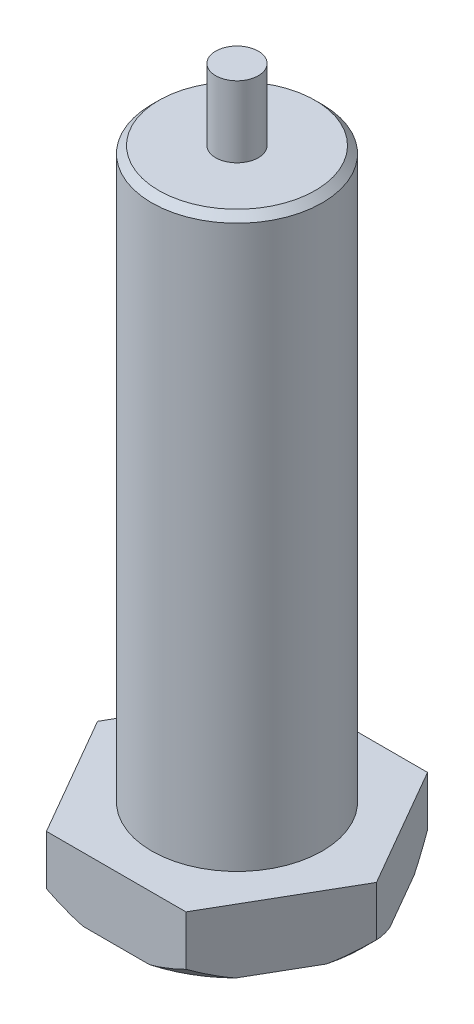
ISO-10303-21;
HEADER;
FILE_DESCRIPTION(('STEP AP214'),'2;1');
FILE_NAME('part.step','',(''),(''),'','','');
FILE_SCHEMA(('AUTOMOTIVE_DESIGN { 1 0 10303 214 1 1 1 1 }'));
ENDSEC;
DATA;
#1=APPLICATION_CONTEXT('core data for automotive mechanical design processes');
#2=APPLICATION_PROTOCOL_DEFINITION('international standard','automotive_design',2000,#1);
#3=PRODUCT_CONTEXT('',#1,'mechanical');
#4=PRODUCT('Part','Part','',(#3));
#5=PRODUCT_RELATED_PRODUCT_CATEGORY('part','',(#4));
#6=PRODUCT_DEFINITION_FORMATION('','',#4);
#7=PRODUCT_DEFINITION_CONTEXT('part definition',#1,'design');
#8=PRODUCT_DEFINITION('design','',#6,#7);
#9=PRODUCT_DEFINITION_SHAPE('','',#8);
#10=(LENGTH_UNIT() NAMED_UNIT(*) SI_UNIT(.MILLI.,.METRE.));
#11=(NAMED_UNIT(*) PLANE_ANGLE_UNIT() SI_UNIT($,.RADIAN.));
#12=(NAMED_UNIT(*) SI_UNIT($,.STERADIAN.) SOLID_ANGLE_UNIT());
#13=UNCERTAINTY_MEASURE_WITH_UNIT(LENGTH_MEASURE(1.E-05),#10,'distance_accuracy_value','');
#14=(GEOMETRIC_REPRESENTATION_CONTEXT(3) GLOBAL_UNCERTAINTY_ASSIGNED_CONTEXT((#13)) GLOBAL_UNIT_ASSIGNED_CONTEXT((#10,
#11,#12)) REPRESENTATION_CONTEXT('',''));
#15=CARTESIAN_POINT('',(0.,0.,0.));
#16=DIRECTION('',(0.,0.,1.));
#17=DIRECTION('',(1.,0.,0.));
#18=AXIS2_PLACEMENT_3D('',#15,#16,#17);
#19=CARTESIAN_POINT('',(4.90747728811192,4.5,8.49999999999995));
#20=DIRECTION('',(-0.866025403784442,0.,-0.499999999999995));
#21=DIRECTION('',(-0.499999999999995,0.,0.866025403784442));
#22=AXIS2_PLACEMENT_3D('',#19,#20,#21);
#23=PLANE('',#22);
#24=CARTESIAN_POINT('',(13.2326662424363,5.68129793130995,-5.91965025150134));
#25=CARTESIAN_POINT('',(13.1162303371106,5.49268103974737,-5.71797734765192));
#26=CARTESIAN_POINT('',(12.9993306817783,5.30519881466516,-5.51550120522915));
#27=CARTESIAN_POINT('',(12.7644427884288,4.93293940118731,-5.10866343986483));
#28=CARTESIAN_POINT('',(12.6464544518135,4.74816246179854,-4.90430164614669));
#29=CARTESIAN_POINT('',(12.4089636690778,4.38134272836976,-4.49295554411918));
#30=CARTESIAN_POINT('',(12.2894582603696,4.19930759249871,-4.28596610445728));
#31=CARTESIAN_POINT('',(12.0490307529332,3.83902658190025,-3.86953344604015));
#32=CARTESIAN_POINT('',(11.9281086930962,3.66078060352546,-3.66009029464667));
#33=CARTESIAN_POINT('',(11.6812332381678,3.30389914584097,-3.23248946356893));
#34=CARTESIAN_POINT('',(11.5552335686476,3.12539139678304,-3.01425163422318));
#35=CARTESIAN_POINT('',(11.3012333820461,2.7741680843672,-2.57431040589736));
#36=CARTESIAN_POINT('',(11.1732329427186,2.60145229673873,-2.35260714159088));
#37=CARTESIAN_POINT('',(10.9150163419313,2.26324850984996,-1.90536286966965));
#38=CARTESIAN_POINT('',(10.7848021945026,2.09775438306884,-1.67982535045888));
#39=CARTESIAN_POINT('',(10.5217029065947,1.77552442691289,-1.22412401636721));
#40=CARTESIAN_POINT('',(10.3888181140318,1.61878746663282,-0.993960804094993));
#41=CARTESIAN_POINT('',(10.1172126193815,1.3131034423094,-0.523526287745761));
#42=CARTESIAN_POINT('',(9.97842813665329,1.164381552261,-0.283144512358328));
#43=CARTESIAN_POINT('',(9.6972100947022,0.881204924464254,0.203939424306002));
#44=CARTESIAN_POINT('',(9.5547760211525,0.746752211513423,0.450642476423087));
#45=CARTESIAN_POINT('',(9.26674062872542,0.496562572730395,0.949534410484841));
#46=CARTESIAN_POINT('',(9.12116086967094,0.380727392183433,1.20168594972084));
#47=CARTESIAN_POINT('',(8.82602346792519,0.171363651450167,1.71287892475835));
#48=CARTESIAN_POINT('',(8.67646703075684,0.0778284148685671,1.97191827253291));
#49=CARTESIAN_POINT('',(8.40302452442077,-0.0666188933519791,2.44553458645597));
#50=CARTESIAN_POINT('',(8.27976864888044,-0.12227591431339,2.6590200252232));
#51=CARTESIAN_POINT('',(8.03140302503451,-0.213532215119374,3.0892019045779));
#52=CARTESIAN_POINT('',(7.90629354892231,-0.249134410548993,3.30589787371257));
#53=CARTESIAN_POINT('',(7.65520245690741,-0.298450671328251,3.74080040241032));
#54=CARTESIAN_POINT('',(7.52922271033152,-0.31220226427138,3.95900372420442));
#55=CARTESIAN_POINT('',(7.27714825574375,-0.317180016737691,4.39560948684066));
#56=CARTESIAN_POINT('',(7.15105354631751,-0.308405895289244,4.61401193013255));
#57=CARTESIAN_POINT('',(6.90008711744869,-0.268872183088487,5.04869853592748));
#58=CARTESIAN_POINT('',(6.77521300780712,-0.238172317022629,5.2649868383766));
#59=CARTESIAN_POINT('',(6.52715484718689,-0.156426680105267,5.69463617580292));
#60=CARTESIAN_POINT('',(6.40397093633212,-0.105379232779083,5.90799696807843));
#61=CARTESIAN_POINT('',(6.15948648206728,0.0149708460164919,6.33145646452588));
#62=CARTESIAN_POINT('',(6.03819273208176,0.084328020725592,6.54154340214136));
#63=CARTESIAN_POINT('',(5.79815487998059,0.23867581498522,6.9573011577203));
#64=CARTESIAN_POINT('',(5.67941065251413,0.323665663959003,7.16297219279773));
#65=CARTESIAN_POINT('',(5.40171059472822,0.540184838624473,7.64396280214773));
#66=CARTESIAN_POINT('',(5.24386509772279,0.67738899804739,7.9173592227071));
#67=CARTESIAN_POINT('',(4.93264719628276,0.970925156585495,8.45640444022621));
#68=CARTESIAN_POINT('',(4.77927736117969,1.12726788505353,8.7220487869732));
#69=CARTESIAN_POINT('',(4.47625541490703,1.45508985984029,9.24689819372585));
#70=CARTESIAN_POINT('',(4.32661169701155,1.6265999033019,9.50608871615434));
#71=CARTESIAN_POINT('',(4.03084527988625,1.98116484321992,10.018371177788));
#72=CARTESIAN_POINT('',(3.88472193694064,2.16421760655322,10.2714642319416));
#73=CARTESIAN_POINT('',(3.59478678362472,2.54029176379239,10.773646648385));
#74=CARTESIAN_POINT('',(3.45098851829792,2.73335473090789,11.0227125499713));
#75=CARTESIAN_POINT('',(3.16592329593742,3.12681129664801,11.5164599985706));
#76=CARTESIAN_POINT('',(3.02465643208483,3.32720516430125,11.7611413841892));
#77=CARTESIAN_POINT('',(2.74441680641976,3.73368575296569,12.2465306541352));
#78=CARTESIAN_POINT('',(2.6054418015308,3.93976630608928,12.487242423585));
#79=CARTESIAN_POINT('',(2.32931512220333,4.35673312702703,12.9655078615055));
#80=CARTESIAN_POINT('',(2.19216340139376,4.56761927225031,13.2030616102932));
#81=CARTESIAN_POINT('',(1.96055376245671,4.92914544471732,13.6042212724548));
#82=CARTESIAN_POINT('',(1.86569780881451,5.07876836868562,13.7685166035635));
#83=CARTESIAN_POINT('',(1.67705132914126,5.37911798470893,14.0952618910266));
#84=CARTESIAN_POINT('',(1.58325804211787,5.52983773758225,14.25771662956));
#85=CARTESIAN_POINT('',(1.48976562189923,5.68129793130995,14.4196502515013));
#86=B_SPLINE_CURVE_WITH_KNOTS('',3,(#24,#25,#26,#27,#28,#29,#30,#31,#32,#33,#34,#35,#36,#37,#38,
#39,#40,#41,#42,#43,#44,#45,#46,#47,#48,#49,#50,#51,#52,#53,#54,#55,#56,#57,#58,#59,#60,#61,#62,
#63,#64,#65,#66,#67,#68,#69,#70,#71,#72,#73,#74,#75,#76,#77,#78,#79,#80,#81,#82,#83,#84,#85),
.UNSPECIFIED.,.F.,.F.,(4,2,2,2,2,2,2,2,2,2,2,2,2,2,2,2,2,2,2,2,2,2,2,2,2,2,2,2,2,2,4),(0.,
0.899033734706083,1.79814970682813,2.69943147575017,3.60068855949874,4.52707645960335,
5.45342844752593,6.37897851072498,7.30440877029756,8.24878511184261,9.1932952818026,
10.132644331677,11.0717117950455,11.829137360152,12.586452781744,13.3424661310549,
14.0984889104479,14.8524601358718,15.6064934952177,16.3627989161892,17.1190670668093,
18.150849268061,19.1832125730673,20.2177224516603,21.2520417074142,22.2910678122068,
23.3301320853982,24.3681105328969,25.4060625310908,26.1308970907607,26.852791461475),.UNSPECIFIED.);
#87=CARTESIAN_POINT('',(9.81495457622364,0.99984898859778,0.));
#88=VERTEX_POINT('',#87);
#89=CARTESIAN_POINT('',(8.52912929806785,0.,2.22711471142224));
#90=VERTEX_POINT('',#89);
#91=EDGE_CURVE('E288',#88,#90,#86,.T.);
#92=ORIENTED_EDGE('',*,*,#91,.F.);
#93=DIRECTION('',(0.,-1.,0.));
#94=VECTOR('',#93,1.);
#95=CARTESIAN_POINT('',(9.81495457622364,4.5,0.));
#96=LINE('',#95,#94);
#97=CARTESIAN_POINT('',(9.81495457622364,4.5,0.));
#98=VERTEX_POINT('',#97);
#99=EDGE_CURVE('E146',#98,#88,#96,.T.);
#100=ORIENTED_EDGE('',*,*,#99,.F.);
#101=DIRECTION('',(0.499999999999995,0.,-0.866025403784442));
#102=VECTOR('',#101,1.);
#103=CARTESIAN_POINT('',(4.90747728811192,4.5,8.49999999999995));
#104=LINE('',#103,#102);
#105=CARTESIAN_POINT('',(4.90747728811192,4.5,8.49999999999995));
#106=VERTEX_POINT('',#105);
#107=EDGE_CURVE('E201',#106,#98,#104,.T.);
#108=ORIENTED_EDGE('',*,*,#107,.F.);
#109=DIRECTION('',(0.,-1.,0.));
#110=VECTOR('',#109,1.);
#111=CARTESIAN_POINT('',(4.90747728811192,4.5,8.49999999999995));
#112=LINE('',#111,#110);
#113=CARTESIAN_POINT('',(4.90747728811192,0.99984898859778,8.49999999999995));
#114=VERTEX_POINT('',#113);
#115=EDGE_CURVE('E207',#106,#114,#112,.T.);
#116=ORIENTED_EDGE('',*,*,#115,.T.);
#117=CARTESIAN_POINT('',(6.19330256626771,0.,6.2728852885777));
#118=VERTEX_POINT('',#117);
#119=EDGE_CURVE('E191',#118,#114,#86,.T.);
#120=ORIENTED_EDGE('',*,*,#119,.F.);
#121=DIRECTION('',(0.499999999999995,0.,-0.866025403784442));
#122=VECTOR('',#121,1.);
#123=CARTESIAN_POINT('',(4.90747728811192,0.,8.49999999999995));
#124=LINE('',#123,#122);
#125=EDGE_CURVE('E291',#118,#90,#124,.T.);
#126=ORIENTED_EDGE('',*,*,#125,.T.);
#127=EDGE_LOOP('',(#92,#100,#108,#116,#120,#126));
#128=FACE_BOUND('',#127,.T.);
#129=ADVANCED_FACE('F36',(#128),#23,.F.);
#130=CARTESIAN_POINT('',(9.81495457622364,4.5,0.));
#131=DIRECTION('',(-0.866025403784438,0.,0.500000000000001));
#132=DIRECTION('',(0.500000000000001,0.,0.866025403784438));
#133=AXIS2_PLACEMENT_3D('',#130,#131,#132);
#134=PLANE('',#133);
#135=CARTESIAN_POINT('',(1.48976562189902,5.68129793131007,-14.4196502515014));
#136=CARTESIAN_POINT('',(1.60620152722473,5.4926810397475,-14.217977347652));
#137=CARTESIAN_POINT('',(1.723101182557,5.30519881466528,-14.0155012052292));
#138=CARTESIAN_POINT('',(1.95798907590659,4.93293940118744,-13.6086634398649));
#139=CARTESIAN_POINT('',(2.07597741252182,4.74816246179867,-13.4043016461468));
#140=CARTESIAN_POINT('',(2.3134681952575,4.3813427283699,-12.9929555441193));
#141=CARTESIAN_POINT('',(2.43297360396571,4.19930759249885,-12.7859661044574));
#142=CARTESIAN_POINT('',(2.67340111140218,3.83902658190039,-12.3695334460403));
#143=CARTESIAN_POINT('',(2.79432317123914,3.6607806035256,-12.1600902946468));
#144=CARTESIAN_POINT('',(3.04119862616757,3.30389914584111,-11.7324894635691));
#145=CARTESIAN_POINT('',(3.16719829568769,3.12539139678319,-11.5142516342233));
#146=CARTESIAN_POINT('',(3.42119848228921,2.77416808436735,-11.0743104058975));
#147=CARTESIAN_POINT('',(3.54919892161677,2.60145229673888,-10.8526071415911));
#148=CARTESIAN_POINT('',(3.80741552240401,2.26324850985011,-10.4053628696698));
#149=CARTESIAN_POINT('',(3.9376296698327,2.097754383069,-10.1798253504591));
#150=CARTESIAN_POINT('',(4.20072895774059,1.77552442691304,-9.72412401636743));
#151=CARTESIAN_POINT('',(4.3336137503035,1.61878746663297,-9.49396080409522));
#152=CARTESIAN_POINT('',(4.60521924495382,1.31310344230954,-9.02352628774599));
#153=CARTESIAN_POINT('',(4.74400372768204,1.16438155226113,-8.78314451235855));
#154=CARTESIAN_POINT('',(5.02522176963314,0.881204924464364,-8.29606057569421));
#155=CARTESIAN_POINT('',(5.16765584318284,0.746752211513522,-8.04935752357712));
#156=CARTESIAN_POINT('',(5.45569123560994,0.496562572730474,-7.55046558951535));
#157=CARTESIAN_POINT('',(5.60127099466442,0.380727392183501,-7.29831405027935));
#158=CARTESIAN_POINT('',(5.89640839641019,0.171363651450212,-6.78712107524182));
#159=CARTESIAN_POINT('',(6.04596483357853,0.0778284148686002,-6.52808172746726));
#160=CARTESIAN_POINT('',(6.31940733991461,-0.0666188933519604,-6.0544654135442));
#161=CARTESIAN_POINT('',(6.44266321545494,-0.122275914313375,-5.84097997477696));
#162=CARTESIAN_POINT('',(6.69102883930088,-0.213532215119371,-5.41079809542227));
#163=CARTESIAN_POINT('',(6.81613831541308,-0.249134410548998,-5.1941021262876));
#164=CARTESIAN_POINT('',(7.06722940742798,-0.298450671328269,-4.75919959758985));
#165=CARTESIAN_POINT('',(7.19320915400387,-0.312202264271404,-4.54099627579575));
#166=CARTESIAN_POINT('',(7.44528360859165,-0.317180016737728,-4.10439051315951));
#167=CARTESIAN_POINT('',(7.5713783180179,-0.308405895289288,-3.88598806986762));
#168=CARTESIAN_POINT('',(7.82234474688672,-0.268872183088543,-3.45130146407269));
#169=CARTESIAN_POINT('',(7.94721885652829,-0.238172317022692,-3.23501316162357));
#170=CARTESIAN_POINT('',(8.19527701714852,-0.156426680105341,-2.80536382419725));
#171=CARTESIAN_POINT('',(8.3184609280033,-0.105379232779161,-2.59200303192174));
#172=CARTESIAN_POINT('',(8.56294538226814,0.0149708460164057,-2.16854353547428));
#173=CARTESIAN_POINT('',(8.68423913225366,0.0843280207255013,-1.9584565978588));
#174=CARTESIAN_POINT('',(8.92427698435484,0.238675814985123,-1.54269884227986));
#175=CARTESIAN_POINT('',(9.0430212118213,0.323665663958903,-1.33702780720243));
#176=CARTESIAN_POINT('',(9.3207212696072,0.540184838624358,-0.856037197852441));
#177=CARTESIAN_POINT('',(9.47856676661262,0.67738899804726,-0.582640777293089));
#178=CARTESIAN_POINT('',(9.78978466805265,0.970925156585336,-0.0435955597740121));
#179=CARTESIAN_POINT('',(9.94315450315571,1.12726788505336,0.222048786972955));
#180=CARTESIAN_POINT('',(10.2461764494284,1.45508985984009,0.746898193725576));
#181=CARTESIAN_POINT('',(10.3958201673238,1.62659990330168,1.00608871615404));
#182=CARTESIAN_POINT('',(10.6915865844491,1.98116484321966,1.51837117778764));
#183=CARTESIAN_POINT('',(10.8377099273947,2.16421760655295,1.77146423194123));
#184=CARTESIAN_POINT('',(11.1276450807106,2.54029176379208,2.27364664838466));
#185=CARTESIAN_POINT('',(11.2714433460374,2.73335473090757,2.52271254997094));
#186=CARTESIAN_POINT('',(11.5565085683979,3.12681129664765,3.01645999857022));
#187=CARTESIAN_POINT('',(11.6977754322505,3.32720516430087,3.2611413841888));
#188=CARTESIAN_POINT('',(11.9780150579155,3.73368575296528,3.74653065413477));
#189=CARTESIAN_POINT('',(12.1169900628045,3.93976630608885,3.98724242358456));
#190=CARTESIAN_POINT('',(12.393116742132,4.35673312702657,4.465507861505));
#191=CARTESIAN_POINT('',(12.5302684629415,4.56761927224983,4.70306161029267));
#192=CARTESIAN_POINT('',(12.7618781018786,4.92914544471692,5.10422127245442));
#193=CARTESIAN_POINT('',(12.8567340555209,5.07876836868533,5.26851660356322));
#194=CARTESIAN_POINT('',(13.0453805351943,5.37911798470884,5.59526189102653));
#195=CARTESIAN_POINT('',(13.1391738222177,5.52983773758227,5.75771662956005));
#196=CARTESIAN_POINT('',(13.2326662424364,5.68129793131007,5.91965025150142));
#197=B_SPLINE_CURVE_WITH_KNOTS('',3,(#135,#136,#137,#138,#139,#140,#141,#142,#143,#144,#145,
#146,#147,#148,#149,#150,#151,#152,#153,#154,#155,#156,#157,#158,#159,#160,#161,#162,#163,#164,
#165,#166,#167,#168,#169,#170,#171,#172,#173,#174,#175,#176,#177,#178,#179,#180,#181,#182,#183,
#184,#185,#186,#187,#188,#189,#190,#191,#192,#193,#194,#195,#196),.UNSPECIFIED.,.F.,.F.,(4,2,2,
2,2,2,2,2,2,2,2,2,2,2,2,2,2,2,2,2,2,2,2,2,2,2,2,2,2,2,4),(0.,0.899033734706069,1.7981497068281,
2.69943147575012,3.60068855949867,4.52707645960327,5.45342844752584,6.37897851072486,
7.30440877029742,8.24878511184251,9.19329528180253,10.132644331677,11.0717117950455,
11.8291373601521,12.586452781744,13.342466131055,14.098488910448,14.8524601358718,
15.6064934952178,16.3627989161893,17.1190670668093,18.1508492680609,19.1832125730672,
20.2177224516602,21.2520417074139,22.2910678122065,23.3301320853978,24.3681105328964,
25.4060625310903,26.1308970907606,26.8527914614754),.UNSPECIFIED.);
#198=CARTESIAN_POINT('',(4.9074772881118,0.99984898859778,-8.50000000000002));
#199=VERTEX_POINT('',#198);
#200=CARTESIAN_POINT('',(6.19330256626758,0.,-6.27288528857783));
#201=VERTEX_POINT('',#200);
#202=EDGE_CURVE('E52',#199,#201,#197,.T.);
#203=ORIENTED_EDGE('',*,*,#202,.F.);
#204=DIRECTION('',(0.,-1.,0.));
#205=VECTOR('',#204,1.);
#206=CARTESIAN_POINT('',(4.9074772881118,4.5,-8.50000000000002));
#207=LINE('',#206,#205);
#208=CARTESIAN_POINT('',(4.9074772881118,4.5,-8.50000000000002));
#209=VERTEX_POINT('',#208);
#210=EDGE_CURVE('E136',#209,#199,#207,.T.);
#211=ORIENTED_EDGE('',*,*,#210,.F.);
#212=DIRECTION('',(-0.500000000000001,0.,-0.866025403784438));
#213=VECTOR('',#212,1.);
#214=CARTESIAN_POINT('',(9.81495457622364,4.5,0.));
#215=LINE('',#214,#213);
#216=EDGE_CURVE('E293',#98,#209,#215,.T.);
#217=ORIENTED_EDGE('',*,*,#216,.F.);
#218=ORIENTED_EDGE('',*,*,#99,.T.);
#219=CARTESIAN_POINT('',(8.52912929806787,0.,-2.22711471142218));
#220=VERTEX_POINT('',#219);
#221=EDGE_CURVE('E141',#220,#88,#197,.T.);
#222=ORIENTED_EDGE('',*,*,#221,.F.);
#223=DIRECTION('',(-0.500000000000001,0.,-0.866025403784438));
#224=VECTOR('',#223,1.);
#225=CARTESIAN_POINT('',(9.81495457622364,0.,0.));
#226=LINE('',#225,#224);
#227=EDGE_CURVE('E140',#220,#201,#226,.T.);
#228=ORIENTED_EDGE('',*,*,#227,.T.);
#229=EDGE_LOOP('',(#203,#211,#217,#218,#222,#228));
#230=FACE_BOUND('',#229,.T.);
#231=ADVANCED_FACE('F135',(#230),#134,.F.);
#232=CARTESIAN_POINT('',(4.9074772881118,4.5,-8.50000000000002));
#233=DIRECTION('',(0.,0.,1.));
#234=DIRECTION('',(1.,0.,0.));
#235=AXIS2_PLACEMENT_3D('',#232,#233,#234);
#236=PLANE('',#235);
#237=CARTESIAN_POINT('',(-10.8271275396133,4.94994765451788,-8.49999999999997));
#238=CARTESIAN_POINT('',(-10.5840902205834,4.75881674989781,-8.49999999999997));
#239=CARTESIAN_POINT('',(-10.3398830864861,4.56915421456417,-8.49999999999997));
#240=CARTESIAN_POINT('',(-9.8486761530712,4.19339733123107,-8.49999999999997));
#241=CARTESIAN_POINT('',(-9.60167589073034,4.00730358904256,-8.49999999999997));
#242=CARTESIAN_POINT('',(-9.10324329392682,3.6384422206059,-8.49999999999997));
#243=CARTESIAN_POINT('',(-8.85179477945548,3.45569640035401,-8.49999999999997));
#244=CARTESIAN_POINT('',(-8.34519960479285,3.09542025906312,-8.49999999999998));
#245=CARTESIAN_POINT('',(-8.0900531337748,2.9178896726293,-8.49999999999998));
#246=CARTESIAN_POINT('',(-7.56266409750329,2.56050071799972,-8.49999999999998));
#247=CARTESIAN_POINT('',(-7.29020201848036,2.3809650409406,-8.49999999999998));
#248=CARTESIAN_POINT('',(-6.73969392844463,2.03055648058957,-8.49999999999998));
#249=CARTESIAN_POINT('',(-6.46164729306529,1.85968457353938,-8.49999999999998));
#250=CARTESIAN_POINT('',(-5.89965679565409,1.52918697672337,-8.49999999999998));
#251=CARTESIAN_POINT('',(-5.61572578464486,1.36953956185934,-8.49999999999998));
#252=CARTESIAN_POINT('',(-5.0405699228114,1.06406341165254,-8.49999999999999));
#253=CARTESIAN_POINT('',(-4.74934735250172,0.918230422301081,-8.49999999999999));
#254=CARTESIAN_POINT('',(-4.18946914309581,0.658372003619838,-8.49999999999999));
#255=CARTESIAN_POINT('',(-3.92162286203819,0.542615671771826,-8.49999999999999));
#256=CARTESIAN_POINT('',(-3.37896009196004,0.328484225975245,-8.49999999999999));
#257=CARTESIAN_POINT('',(-3.1041429356376,0.230110783276145,-8.49999999999999));
#258=CARTESIAN_POINT('',(-2.55094820631331,0.0555940079232926,-8.49999999999999));
#259=CARTESIAN_POINT('',(-2.2726487999454,-0.0207937287362269,-8.49999999999999));
#260=CARTESIAN_POINT('',(-1.71039951237603,-0.149043056628818,-8.49999999999999));
#261=CARTESIAN_POINT('',(-1.42645037257583,-0.200907844117666,-8.5));
#262=CARTESIAN_POINT('',(-0.849506938840438,-0.277628249798879,-8.5));
#263=CARTESIAN_POINT('',(-0.556442442998363,-0.30196740714026,-8.5));
#264=CARTESIAN_POINT('',(0.0306238433639257,-0.320113794625547,-8.5));
#265=CARTESIAN_POINT('',(0.324625553036599,-0.313923590731633,-8.5));
#266=CARTESIAN_POINT('',(0.911321488666063,-0.271418445773183,-8.5));
#267=CARTESIAN_POINT('',(1.20400878754174,-0.235009711797439,-8.50000000000001));
#268=CARTESIAN_POINT('',(1.78456187863908,-0.13450754487315,-8.50000000000001));
#269=CARTESIAN_POINT('',(2.07242635933723,-0.0704067042776457,-8.50000000000001));
#270=CARTESIAN_POINT('',(2.73115237662276,0.105611249570729,-8.50000000000001));
#271=CARTESIAN_POINT('',(3.09967150095835,0.226224221299103,-8.50000000000001));
#272=CARTESIAN_POINT('',(3.82451127559434,0.499607388733537,-8.50000000000001));
#273=CARTESIAN_POINT('',(4.1808243772653,0.652397080634709,-8.50000000000001));
#274=CARTESIAN_POINT('',(4.88441848693544,0.983388299621264,-8.50000000000002));
#275=CARTESIAN_POINT('',(5.23161614896731,1.16176461492496,-8.50000000000002));
#276=CARTESIAN_POINT('',(5.91571208751049,1.53689350388501,-8.50000000000002));
#277=CARTESIAN_POINT('',(6.25261277608608,1.73364172944932,-8.50000000000002));
#278=CARTESIAN_POINT('',(6.95926787695551,2.16642131305814,-8.50000000000002));
#279=CARTESIAN_POINT('',(7.32788750328097,2.40429319767809,-8.50000000000002));
#280=CARTESIAN_POINT('',(8.0563886138117,2.89311983207017,-8.50000000000003));
#281=CARTESIAN_POINT('',(8.41626826442034,3.14407729295504,-8.50000000000003));
#282=CARTESIAN_POINT('',(9.12113372743326,3.65029827720946,-8.50000000000003));
#283=CARTESIAN_POINT('',(9.46627319829205,3.90534870144919,-8.50000000000003));
#284=CARTESIAN_POINT('',(9.97968332853407,4.2933490456831,-8.50000000000003));
#285=CARTESIAN_POINT('',(10.1500488044062,4.42354337835601,-8.50000000000004));
#286=CARTESIAN_POINT('',(10.4895080452844,4.68556680929684,-8.50000000000004));
#287=CARTESIAN_POINT('',(10.6586018585557,4.81739584501238,-8.50000000000004));
#288=CARTESIAN_POINT('',(10.8271275396132,4.94994765451788,-8.50000000000004));
#289=B_SPLINE_CURVE_WITH_KNOTS('',3,(#237,#238,#239,#240,#241,#242,#243,#244,#245,#246,#247,
#248,#249,#250,#251,#252,#253,#254,#255,#256,#257,#258,#259,#260,#261,#262,#263,#264,#265,#266,
#267,#268,#269,#270,#271,#272,#273,#274,#275,#276,#277,#278,#279,#280,#281,#282,#283,#284,#285,
#286,#287,#288),.UNSPECIFIED.,.F.,.F.,(4,2,2,2,2,2,2,2,2,2,2,2,2,2,2,2,2,2,2,2,2,2,2,2,2,4),(0.,
0.927580465773649,1.85531702108129,2.78778547796483,3.72020640054535,4.69896044712775,
5.67782453664636,6.6547386673756,7.63135098290449,8.50622995498522,9.38119299516315,
10.2460164703223,11.1107271956038,11.9914063864206,12.8720115582966,13.7553602373442,
14.6389453588898,15.8001676690422,16.9620956101848,18.1323765997144,19.3023813167005,
20.6181210512495,21.9341344766967,23.2214620941611,23.8647075434629,24.5079284542848),.UNSPECIFIED.);
#290=CARTESIAN_POINT('',(-4.90747728811186,0.99984898859778,-8.49999999999998));
#291=VERTEX_POINT('',#290);
#292=CARTESIAN_POINT('',(-2.33582673180031,0.,-8.49999999999999));
#293=VERTEX_POINT('',#292);
#294=EDGE_CURVE('E60',#291,#293,#289,.T.);
#295=ORIENTED_EDGE('',*,*,#294,.F.);
#296=DIRECTION('',(0.,-1.,0.));
#297=VECTOR('',#296,1.);
#298=CARTESIAN_POINT('',(-4.90747728811186,4.5,-8.49999999999999));
#299=LINE('',#298,#297);
#300=CARTESIAN_POINT('',(-4.90747728811186,4.5,-8.49999999999999));
#301=VERTEX_POINT('',#300);
#302=EDGE_CURVE('E147',#301,#291,#299,.T.);
#303=ORIENTED_EDGE('',*,*,#302,.F.);
#304=DIRECTION('',(-1.,0.,0.));
#305=VECTOR('',#304,1.);
#306=CARTESIAN_POINT('',(4.9074772881118,4.5,-8.50000000000002));
#307=LINE('',#306,#305);
#308=EDGE_CURVE('E145',#209,#301,#307,.T.);
#309=ORIENTED_EDGE('',*,*,#308,.F.);
#310=ORIENTED_EDGE('',*,*,#210,.T.);
#311=CARTESIAN_POINT('',(2.33582673180025,0.,-8.50000000000001));
#312=VERTEX_POINT('',#311);
#313=EDGE_CURVE('E124',#312,#199,#289,.T.);
#314=ORIENTED_EDGE('',*,*,#313,.F.);
#315=DIRECTION('',(-1.,0.,0.));
#316=VECTOR('',#315,1.);
#317=CARTESIAN_POINT('',(4.9074772881118,0.,-8.50000000000002));
#318=LINE('',#317,#316);
#319=EDGE_CURVE('E203',#312,#293,#318,.T.);
#320=ORIENTED_EDGE('',*,*,#319,.T.);
#321=EDGE_LOOP('',(#295,#303,#309,#310,#314,#320));
#322=FACE_BOUND('',#321,.T.);
#323=ADVANCED_FACE('F143',(#322),#236,.F.);
#324=CARTESIAN_POINT('',(-4.90747728811186,4.5,-8.49999999999999));
#325=DIRECTION('',(0.866025403784442,0.,0.499999999999995));
#326=DIRECTION('',(0.499999999999995,0.,-0.866025403784442));
#327=AXIS2_PLACEMENT_3D('',#324,#325,#326);
#328=PLANE('',#327);
#329=CARTESIAN_POINT('',(-13.2326662424364,5.68129793131004,5.91965025150149));
#330=CARTESIAN_POINT('',(-13.1162303371107,5.49268103974747,5.71797734765206));
#331=CARTESIAN_POINT('',(-12.9993306817784,5.30519881466526,5.51550120522929));
#332=CARTESIAN_POINT('',(-12.7644427884288,4.93293940118742,5.10866343986498));
#333=CARTESIAN_POINT('',(-12.6464544518136,4.74816246179865,4.90430164614685));
#334=CARTESIAN_POINT('',(-12.4089636690779,4.38134272836987,4.49295554411935));
#335=CARTESIAN_POINT('',(-12.2894582603697,4.19930759249882,4.28596610445745));
#336=CARTESIAN_POINT('',(-12.0490307529332,3.83902658190036,3.86953344604033));
#337=CARTESIAN_POINT('',(-11.9281086930963,3.66078060352557,3.66009029464685));
#338=CARTESIAN_POINT('',(-11.6812332381678,3.30389914584109,3.23248946356912));
#339=CARTESIAN_POINT('',(-11.5552335686477,3.12539139678317,3.01425163422338));
#340=CARTESIAN_POINT('',(-11.3012333820462,2.77416808436732,2.57431040589757));
#341=CARTESIAN_POINT('',(-11.1732329427186,2.60145229673885,2.3526071415911));
#342=CARTESIAN_POINT('',(-10.9150163419314,2.26324850985008,1.90536286966987));
#343=CARTESIAN_POINT('',(-10.7848021945027,2.09775438306897,1.67982535045911));
#344=CARTESIAN_POINT('',(-10.5217029065948,1.77552442691301,1.22412401636745));
#345=CARTESIAN_POINT('',(-10.3888181140319,1.61878746663294,0.993960804095238));
#346=CARTESIAN_POINT('',(-10.1172126193816,1.31310344230951,0.523526287746007));
#347=CARTESIAN_POINT('',(-9.97842813665339,1.16438155226111,0.283144512358569));
#348=CARTESIAN_POINT('',(-9.69721009470229,0.881204924464344,-0.203939424305772));
#349=CARTESIAN_POINT('',(-9.55477602115259,0.746752211513502,-0.450642476422863));
#350=CARTESIAN_POINT('',(-9.2667406287255,0.496562572730457,-0.949534410484627));
#351=CARTESIAN_POINT('',(-9.12116086967102,0.380727392183487,-1.20168594972063));
#352=CARTESIAN_POINT('',(-8.82602346792526,0.171363651450202,-1.71287892475816));
#353=CARTESIAN_POINT('',(-8.67646703075691,0.0778284148685918,-1.97191827253272));
#354=CARTESIAN_POINT('',(-8.40302452442084,-0.0666188933519677,-2.44553458645578));
#355=CARTESIAN_POINT('',(-8.27976864888051,-0.122275914313383,-2.65902002522302));
#356=CARTESIAN_POINT('',(-8.03140302503458,-0.213532215119377,-3.08920190457772));
#357=CARTESIAN_POINT('',(-7.90629354892237,-0.249134410549002,-3.30589787371238));
#358=CARTESIAN_POINT('',(-7.65520245690748,-0.298450671328272,-3.74080040241014));
#359=CARTESIAN_POINT('',(-7.52922271033159,-0.312202264271407,-3.95900372420424));
#360=CARTESIAN_POINT('',(-7.27714825574381,-0.317180016737729,-4.39560948684048));
#361=CARTESIAN_POINT('',(-7.15105354631757,-0.308405895289286,-4.61401193013237));
#362=CARTESIAN_POINT('',(-6.90008711744875,-0.268872183088539,-5.0486985359273));
#363=CARTESIAN_POINT('',(-6.77521300780718,-0.238172317022688,-5.26498683837642));
#364=CARTESIAN_POINT('',(-6.52715484718695,-0.156426680105337,-5.69463617580274));
#365=CARTESIAN_POINT('',(-6.40397093633218,-0.105379232779156,-5.90799696807825));
#366=CARTESIAN_POINT('',(-6.15948648206734,0.0149708460164116,-6.33145646452571));
#367=CARTESIAN_POINT('',(-6.03819273208182,0.0843280207255071,-6.54154340214119));
#368=CARTESIAN_POINT('',(-5.79815487998065,0.238675814985128,-6.95730115772013));
#369=CARTESIAN_POINT('',(-5.67941065251418,0.323665663958908,-7.16297219279756));
#370=CARTESIAN_POINT('',(-5.40171059472829,0.540184838624365,-7.64396280214756));
#371=CARTESIAN_POINT('',(-5.24386509772287,0.677388998047269,-7.91735922270691));
#372=CARTESIAN_POINT('',(-4.93264719628285,0.97092515658535,-8.45640444022599));
#373=CARTESIAN_POINT('',(-4.77927736117978,1.12726788505337,-8.72204878697296));
#374=CARTESIAN_POINT('',(-4.47625541490714,1.45508985984011,-9.24689819372559));
#375=CARTESIAN_POINT('',(-4.32661169701167,1.6265999033017,-9.50608871615406));
#376=CARTESIAN_POINT('',(-4.03084527988639,1.98116484321969,-10.0183711777877));
#377=CARTESIAN_POINT('',(-3.88472193694079,2.16421760655297,-10.2714642319413));
#378=CARTESIAN_POINT('',(-3.59478678362488,2.54029176379211,-10.7736466483847));
#379=CARTESIAN_POINT('',(-3.45098851829809,2.7333547309076,-11.022712549971));
#380=CARTESIAN_POINT('',(-3.1659232959376,3.12681129664769,-11.5164599985703));
#381=CARTESIAN_POINT('',(-3.02465643208503,3.32720516430091,-11.7611413841888));
#382=CARTESIAN_POINT('',(-2.74441680641997,3.73368575296532,-12.2465306541348));
#383=CARTESIAN_POINT('',(-2.60544180153102,3.93976630608889,-12.4872424235846));
#384=CARTESIAN_POINT('',(-2.32931512220356,4.35673312702661,-12.9655078615051));
#385=CARTESIAN_POINT('',(-2.19216340139399,4.56761927224987,-13.2030616102927));
#386=CARTESIAN_POINT('',(-1.9605537624569,4.92914544471696,-13.6042212724545));
#387=CARTESIAN_POINT('',(-1.86569780881464,5.07876836868535,-13.7685166035633));
#388=CARTESIAN_POINT('',(-1.67705132914127,5.37911798470885,-14.0952618910265));
#389=CARTESIAN_POINT('',(-1.58325804211782,5.52983773758226,-14.25771662956));
#390=CARTESIAN_POINT('',(-1.48976562189913,5.68129793131005,-14.4196502515014));
#391=B_SPLINE_CURVE_WITH_KNOTS('',3,(#329,#330,#331,#332,#333,#334,#335,#336,#337,#338,#339,
#340,#341,#342,#343,#344,#345,#346,#347,#348,#349,#350,#351,#352,#353,#354,#355,#356,#357,#358,
#359,#360,#361,#362,#363,#364,#365,#366,#367,#368,#369,#370,#371,#372,#373,#374,#375,#376,#377,
#378,#379,#380,#381,#382,#383,#384,#385,#386,#387,#388,#389,#390),.UNSPECIFIED.,.F.,.F.,(4,2,2,
2,2,2,2,2,2,2,2,2,2,2,2,2,2,2,2,2,2,2,2,2,2,2,2,2,2,2,4),(0.,0.899033734706071,1.7981497068281,
2.69943147575013,3.60068855949868,4.52707645960327,5.45342844752584,6.37897851072487,
7.30440877029743,8.24878511184252,9.19329528180253,10.132644331677,11.0717117950455,
11.829137360152,12.586452781744,13.3424661310549,14.0984889104479,14.8524601358718,
15.6064934952177,16.3627989161892,17.1190670668093,18.1508492680609,19.1832125730672,
20.2177224516602,21.2520417074139,22.2910678122065,23.3301320853978,24.3681105328965,
25.4060625310903,26.1308970907606,26.8527914614753),.UNSPECIFIED.);
#392=CARTESIAN_POINT('',(-9.81495457622365,0.99984898859778,0.));
#393=VERTEX_POINT('',#392);
#394=CARTESIAN_POINT('',(-8.52912929806789,0.,-2.22711471142212));
#395=VERTEX_POINT('',#394);
#396=EDGE_CURVE('E178',#393,#395,#391,.T.);
#397=ORIENTED_EDGE('',*,*,#396,.F.);
#398=DIRECTION('',(0.,-1.,0.));
#399=VECTOR('',#398,1.);
#400=CARTESIAN_POINT('',(-9.81495457622364,4.5,0.));
#401=LINE('',#400,#399);
#402=CARTESIAN_POINT('',(-9.81495457622364,4.5,0.));
#403=VERTEX_POINT('',#402);
#404=EDGE_CURVE('E153',#403,#393,#401,.T.);
#405=ORIENTED_EDGE('',*,*,#404,.F.);
#406=DIRECTION('',(-0.499999999999995,0.,0.866025403784442));
#407=VECTOR('',#406,1.);
#408=CARTESIAN_POINT('',(-4.90747728811186,4.5,-8.49999999999999));
#409=LINE('',#408,#407);
#410=EDGE_CURVE('E303',#301,#403,#409,.T.);
#411=ORIENTED_EDGE('',*,*,#410,.F.);
#412=ORIENTED_EDGE('',*,*,#302,.T.);
#413=CARTESIAN_POINT('',(-6.19330256626762,0.,-6.27288528857779));
#414=VERTEX_POINT('',#413);
#415=EDGE_CURVE('E267',#414,#291,#391,.T.);
#416=ORIENTED_EDGE('',*,*,#415,.F.);
#417=DIRECTION('',(-0.499999999999995,0.,0.866025403784442));
#418=VECTOR('',#417,1.);
#419=CARTESIAN_POINT('',(-4.90747728811186,0.,-8.49999999999999));
#420=LINE('',#419,#418);
#421=EDGE_CURVE('E198',#414,#395,#420,.T.);
#422=ORIENTED_EDGE('',*,*,#421,.T.);
#423=EDGE_LOOP('',(#397,#405,#411,#412,#416,#422));
#424=FACE_BOUND('',#423,.T.);
#425=ADVANCED_FACE('F276',(#424),#328,.F.);
#426=CARTESIAN_POINT('',(-9.81495457622364,4.5,0.));
#427=DIRECTION('',(0.866025403784434,0.,-0.500000000000007));
#428=DIRECTION('',(-0.500000000000007,0.,-0.866025403784435));
#429=AXIS2_PLACEMENT_3D('',#426,#427,#428);
#430=PLANE('',#429);
#431=CARTESIAN_POINT('',(-1.4897656218989,5.68129793131009,14.4196502515015));
#432=CARTESIAN_POINT('',(-1.60620152722462,5.49268103974752,14.217977347652));
#433=CARTESIAN_POINT('',(-1.72310118255688,5.3051988146653,14.0155012052293));
#434=CARTESIAN_POINT('',(-1.95798907590647,4.93293940118746,13.608663439865));
#435=CARTESIAN_POINT('',(-2.07597741252171,4.74816246179869,13.4043016461468));
#436=CARTESIAN_POINT('',(-2.3134681952574,4.38134272836992,12.9929555441193));
#437=CARTESIAN_POINT('',(-2.4329736039656,4.19930759249887,12.7859661044575));
#438=CARTESIAN_POINT('',(-2.67340111140208,3.83902658190041,12.3695334460403));
#439=CARTESIAN_POINT('',(-2.79432317123903,3.66078060352563,12.1600902946469));
#440=CARTESIAN_POINT('',(-3.04119862616747,3.30389914584114,11.7324894635691));
#441=CARTESIAN_POINT('',(-3.16719829568759,3.12539139678322,11.5142516342234));
#442=CARTESIAN_POINT('',(-3.42119848228911,2.77416808436738,11.0743104058976));
#443=CARTESIAN_POINT('',(-3.54919892161667,2.60145229673891,10.8526071415911));
#444=CARTESIAN_POINT('',(-3.80741552240391,2.26324850985014,10.4053628696699));
#445=CARTESIAN_POINT('',(-3.9376296698326,2.09775438306903,10.1798253504592));
#446=CARTESIAN_POINT('',(-4.20072895774049,1.77552442691307,9.7241240163675));
#447=CARTESIAN_POINT('',(-4.33361375030341,1.618787466633,9.4939608040953));
#448=CARTESIAN_POINT('',(-4.60521924495373,1.31310344230956,9.02352628774607));
#449=CARTESIAN_POINT('',(-4.74400372768195,1.16438155226116,8.78314451235863));
#450=CARTESIAN_POINT('',(-5.02522176963305,0.881204924464387,8.29606057569429));
#451=CARTESIAN_POINT('',(-5.16765584318276,0.746752211513542,8.0493575235772));
#452=CARTESIAN_POINT('',(-5.45569123560986,0.496562572730491,7.55046558951543));
#453=CARTESIAN_POINT('',(-5.60127099466435,0.380727392183518,7.29831405027943));
#454=CARTESIAN_POINT('',(-5.89640839641011,0.171363651450226,6.7871210752419));
#455=CARTESIAN_POINT('',(-6.04596483357846,0.0778284148686112,6.52808172746734));
#456=CARTESIAN_POINT('',(-6.31940733991455,-0.066618893351952,6.05446541354428));
#457=CARTESIAN_POINT('',(-6.44266321545488,-0.122275914313367,5.84097997477704));
#458=CARTESIAN_POINT('',(-6.69102883930082,-0.213532215119365,5.41079809542235));
#459=CARTESIAN_POINT('',(-6.81613831541302,-0.249134410548993,5.19410212628768));
#460=CARTESIAN_POINT('',(-7.06722940742792,-0.298450671328268,4.75919959758993));
#461=CARTESIAN_POINT('',(-7.19320915400382,-0.312202264271404,4.54099627579583));
#462=CARTESIAN_POINT('',(-7.4452836085916,-0.317180016737729,4.10439051315959));
#463=CARTESIAN_POINT('',(-7.57137831801785,-0.308405895289289,3.8859880698677));
#464=CARTESIAN_POINT('',(-7.82234474688668,-0.268872183088546,3.45130146407278));
#465=CARTESIAN_POINT('',(-7.94721885652825,-0.238172317022697,3.23501316162366));
#466=CARTESIAN_POINT('',(-8.19527701714848,-0.156426680105349,2.80536382419733));
#467=CARTESIAN_POINT('',(-8.31846092800326,-0.10537923277917,2.59200303192182));
#468=CARTESIAN_POINT('',(-8.56294538226811,0.0149708460163957,2.16854353547437));
#469=CARTESIAN_POINT('',(-8.68423913225363,0.0843280207254922,1.95845659785889));
#470=CARTESIAN_POINT('',(-8.92427698435482,0.238675814985113,1.54269884227995));
#471=CARTESIAN_POINT('',(-9.04302121182128,0.323665663958891,1.33702780720252));
#472=CARTESIAN_POINT('',(-9.32072126960718,0.540184838624343,0.856037197852533));
#473=CARTESIAN_POINT('',(-9.4785667666126,0.677388998047243,0.582640777293185));
#474=CARTESIAN_POINT('',(-9.78978466805263,0.970925156585315,0.043595559774115));
#475=CARTESIAN_POINT('',(-9.94315450315569,1.12726788505334,-0.222048786972848));
#476=CARTESIAN_POINT('',(-10.2461764494283,1.45508985984006,-0.746898193725462));
#477=CARTESIAN_POINT('',(-10.3958201673238,1.62659990330165,-1.00608871615393));
#478=CARTESIAN_POINT('',(-10.6915865844491,1.98116484321963,-1.51837117778752));
#479=CARTESIAN_POINT('',(-10.8377099273947,2.16421760655291,-1.77146423194111));
#480=CARTESIAN_POINT('',(-11.1276450807106,2.54029176379204,-2.27364664838453));
#481=CARTESIAN_POINT('',(-11.2714433460374,2.73335473090752,-2.5227125499708));
#482=CARTESIAN_POINT('',(-11.5565085683979,3.1268112966476,-3.01645999857007));
#483=CARTESIAN_POINT('',(-11.6977754322505,3.32720516430082,-3.26114138418865));
#484=CARTESIAN_POINT('',(-11.9780150579155,3.73368575296523,-3.74653065413462));
#485=CARTESIAN_POINT('',(-12.1169900628045,3.93976630608879,-3.98724242358441));
#486=CARTESIAN_POINT('',(-12.3931167421319,4.3567331270265,-4.46550786150484));
#487=CARTESIAN_POINT('',(-12.5302684629415,4.56761927224976,-4.7030616102925));
#488=CARTESIAN_POINT('',(-12.7618781018786,4.92914544471687,-5.10422127245426));
#489=CARTESIAN_POINT('',(-12.8567340555209,5.07876836868529,-5.26851660356308));
#490=CARTESIAN_POINT('',(-13.0453805351943,5.37911798470883,-5.59526189102643));
#491=CARTESIAN_POINT('',(-13.1391738222178,5.52983773758227,-5.75771662955996));
#492=CARTESIAN_POINT('',(-13.2326662424365,5.68129793131009,-5.91965025150135));
#493=B_SPLINE_CURVE_WITH_KNOTS('',3,(#431,#432,#433,#434,#435,#436,#437,#438,#439,#440,#441,
#442,#443,#444,#445,#446,#447,#448,#449,#450,#451,#452,#453,#454,#455,#456,#457,#458,#459,#460,
#461,#462,#463,#464,#465,#466,#467,#468,#469,#470,#471,#472,#473,#474,#475,#476,#477,#478,#479,
#480,#481,#482,#483,#484,#485,#486,#487,#488,#489,#490,#491,#492),.UNSPECIFIED.,.F.,.F.,(4,2,2,
2,2,2,2,2,2,2,2,2,2,2,2,2,2,2,2,2,2,2,2,2,2,2,2,2,2,2,4),(0.,0.899033734706067,1.79814970682809,
2.69943147575011,3.60068855949866,4.52707645960325,5.45342844752581,6.37897851072483,
7.30440877029739,8.24878511184248,9.19329528180251,10.132644331677,11.0717117950455,
11.829137360152,12.586452781744,13.3424661310549,14.098488910448,14.8524601358718,
15.6064934952178,16.3627989161893,17.1190670668093,18.1508492680609,19.1832125730672,
20.2177224516601,21.2520417074139,22.2910678122064,23.3301320853977,24.3681105328963,
25.4060625310902,26.1308970907606,26.8527914614755),.UNSPECIFIED.);
#494=CARTESIAN_POINT('',(-4.90747728811174,0.99984898859778,8.50000000000005));
#495=VERTEX_POINT('',#494);
#496=CARTESIAN_POINT('',(-6.19330256626753,0.,6.27288528857788));
#497=VERTEX_POINT('',#496);
#498=EDGE_CURVE('E193',#495,#497,#493,.T.);
#499=ORIENTED_EDGE('',*,*,#498,.F.);
#500=DIRECTION('',(0.,-1.,0.));
#501=VECTOR('',#500,1.);
#502=CARTESIAN_POINT('',(-4.90747728811174,4.5,8.50000000000005));
#503=LINE('',#502,#501);
#504=CARTESIAN_POINT('',(-4.90747728811174,4.5,8.50000000000005));
#505=VERTEX_POINT('',#504);
#506=EDGE_CURVE('E210',#505,#495,#503,.T.);
#507=ORIENTED_EDGE('',*,*,#506,.F.);
#508=DIRECTION('',(0.500000000000007,0.,0.866025403784434));
#509=VECTOR('',#508,1.);
#510=CARTESIAN_POINT('',(-9.81495457622364,4.5,0.));
#511=LINE('',#510,#509);
#512=EDGE_CURVE('E221',#403,#505,#511,.T.);
#513=ORIENTED_EDGE('',*,*,#512,.F.);
#514=ORIENTED_EDGE('',*,*,#404,.T.);
#515=CARTESIAN_POINT('',(-8.52912929806785,0.,2.22711471142224));
#516=VERTEX_POINT('',#515);
#517=EDGE_CURVE('E176',#516,#393,#493,.T.);
#518=ORIENTED_EDGE('',*,*,#517,.F.);
#519=DIRECTION('',(0.500000000000007,0.,0.866025403784434));
#520=VECTOR('',#519,1.);
#521=CARTESIAN_POINT('',(-9.81495457622364,0.,0.));
#522=LINE('',#521,#520);
#523=EDGE_CURVE('E188',#516,#497,#522,.T.);
#524=ORIENTED_EDGE('',*,*,#523,.T.);
#525=EDGE_LOOP('',(#499,#507,#513,#514,#518,#524));
#526=FACE_BOUND('',#525,.T.);
#527=ADVANCED_FACE('F187',(#526),#430,.F.);
#528=CARTESIAN_POINT('',(-4.90747728811174,4.5,8.50000000000005));
#529=DIRECTION('',(0.,0.,-1.));
#530=DIRECTION('',(-1.,0.,0.));
#531=AXIS2_PLACEMENT_3D('',#528,#529,#530);
#532=PLANE('',#531);
#533=CARTESIAN_POINT('',(10.8271275396133,4.94994765451789,8.49999999999989));
#534=CARTESIAN_POINT('',(10.5840902205835,4.75881674989781,8.49999999999989));
#535=CARTESIAN_POINT('',(10.3398830864861,4.56915421456417,8.49999999999989));
#536=CARTESIAN_POINT('',(9.84867615307126,4.19339733123107,8.4999999999999));
#537=CARTESIAN_POINT('',(9.60167589073041,4.00730358904257,8.4999999999999));
#538=CARTESIAN_POINT('',(9.10324329392689,3.6384422206059,8.49999999999991));
#539=CARTESIAN_POINT('',(8.85179477945555,3.45569640035401,8.49999999999991));
#540=CARTESIAN_POINT('',(8.34519960479292,3.09542025906312,8.49999999999991));
#541=CARTESIAN_POINT('',(8.09005313377487,2.9178896726293,8.49999999999991));
#542=CARTESIAN_POINT('',(7.56266409750336,2.56050071799973,8.49999999999992));
#543=CARTESIAN_POINT('',(7.29020201848043,2.38096504094061,8.49999999999992));
#544=CARTESIAN_POINT('',(6.7396939284447,2.03055648058958,8.49999999999993));
#545=CARTESIAN_POINT('',(6.46164729306536,1.85968457353938,8.49999999999993));
#546=CARTESIAN_POINT('',(5.89965679565417,1.52918697672338,8.49999999999994));
#547=CARTESIAN_POINT('',(5.61572578464494,1.36953956185935,8.49999999999994));
#548=CARTESIAN_POINT('',(5.04056992281148,1.06406341165254,8.49999999999995));
#549=CARTESIAN_POINT('',(4.7493473525018,0.918230422301087,8.49999999999995));
#550=CARTESIAN_POINT('',(4.18946914309589,0.658372003619845,8.49999999999996));
#551=CARTESIAN_POINT('',(3.92162286203827,0.542615671771833,8.49999999999996));
#552=CARTESIAN_POINT('',(3.37896009196012,0.328484225975251,8.49999999999997));
#553=CARTESIAN_POINT('',(3.10414293563768,0.23011078327615,8.49999999999997));
#554=CARTESIAN_POINT('',(2.55094820631339,0.055594007923296,8.49999999999998));
#555=CARTESIAN_POINT('',(2.27264879994548,-0.0207937287362243,8.49999999999998));
#556=CARTESIAN_POINT('',(1.71039951237611,-0.149043056628817,8.49999999999998));
#557=CARTESIAN_POINT('',(1.42645037257591,-0.200907844117667,8.49999999999999));
#558=CARTESIAN_POINT('',(0.84950693884052,-0.277628249798881,8.49999999999999));
#559=CARTESIAN_POINT('',(0.556442442998445,-0.301967407140262,8.49999999999999));
#560=CARTESIAN_POINT('',(-0.0306238433638439,-0.32011379462555,8.5));
#561=CARTESIAN_POINT('',(-0.324625553036517,-0.313923590731638,8.5));
#562=CARTESIAN_POINT('',(-0.911321488665981,-0.271418445773187,8.50000000000001));
#563=CARTESIAN_POINT('',(-1.20400878754166,-0.235009711797441,8.50000000000001));
#564=CARTESIAN_POINT('',(-1.784561878639,-0.134507544873154,8.50000000000002));
#565=CARTESIAN_POINT('',(-2.07242635933715,-0.0704067042776523,8.50000000000002));
#566=CARTESIAN_POINT('',(-2.73115237662267,0.10561124957072,8.50000000000003));
#567=CARTESIAN_POINT('',(-3.09967150095827,0.226224221299093,8.50000000000003));
#568=CARTESIAN_POINT('',(-3.82451127559425,0.499607388733526,8.50000000000004));
#569=CARTESIAN_POINT('',(-4.18082437726521,0.652397080634695,8.50000000000004));
#570=CARTESIAN_POINT('',(-4.88441848693535,0.983388299621245,8.50000000000005));
#571=CARTESIAN_POINT('',(-5.23161614896721,1.16176461492494,8.50000000000006));
#572=CARTESIAN_POINT('',(-5.91571208751039,1.53689350388499,8.50000000000006));
#573=CARTESIAN_POINT('',(-6.25261277608599,1.73364172944929,8.50000000000006));
#574=CARTESIAN_POINT('',(-6.95926787695541,2.16642131305812,8.50000000000007));
#575=CARTESIAN_POINT('',(-7.32788750328088,2.40429319767807,8.50000000000008));
#576=CARTESIAN_POINT('',(-8.05638861381162,2.89311983207015,8.50000000000008));
#577=CARTESIAN_POINT('',(-8.41626826442027,3.14407729295502,8.50000000000009));
#578=CARTESIAN_POINT('',(-9.12113372743319,3.65029827720945,8.50000000000009));
#579=CARTESIAN_POINT('',(-9.46627319829199,3.90534870144919,8.5000000000001));
#580=CARTESIAN_POINT('',(-9.97968332853402,4.2933490456831,8.5000000000001));
#581=CARTESIAN_POINT('',(-10.1500488044061,4.42354337835601,8.50000000000011));
#582=CARTESIAN_POINT('',(-10.4895080452844,4.68556680929684,8.50000000000011));
#583=CARTESIAN_POINT('',(-10.6586018585557,4.81739584501238,8.50000000000011));
#584=CARTESIAN_POINT('',(-10.8271275396132,4.94994765451788,8.50000000000011));
#585=B_SPLINE_CURVE_WITH_KNOTS('',3,(#533,#534,#535,#536,#537,#538,#539,#540,#541,#542,#543,
#544,#545,#546,#547,#548,#549,#550,#551,#552,#553,#554,#555,#556,#557,#558,#559,#560,#561,#562,
#563,#564,#565,#566,#567,#568,#569,#570,#571,#572,#573,#574,#575,#576,#577,#578,#579,#580,#581,
#582,#583,#584),.UNSPECIFIED.,.F.,.F.,(4,2,2,2,2,2,2,2,2,2,2,2,2,2,2,2,2,2,2,2,2,2,2,2,2,4),(0.,
0.927580465773649,1.85531702108129,2.78778547796482,3.72020640054534,4.69896044712775,
5.67782453664634,6.65473866737559,7.63135098290447,8.5062299549852,9.38119299516313,
10.2460164703223,11.1107271956038,11.9914063864206,12.8720115582966,13.7553602373442,
14.6389453588898,15.8001676690421,16.9620956101847,18.1323765997143,19.3023813167005,
20.6181210512495,21.9341344766967,23.2214620941611,23.8647075434629,24.5079284542848),.UNSPECIFIED.);
#586=CARTESIAN_POINT('',(2.33582673180037,0.,8.49999999999998));
#587=VERTEX_POINT('',#586);
#588=EDGE_CURVE('E223',#114,#587,#585,.T.);
#589=ORIENTED_EDGE('',*,*,#588,.F.);
#590=ORIENTED_EDGE('',*,*,#115,.F.);
#591=DIRECTION('',(1.,0.,0.));
#592=VECTOR('',#591,1.);
#593=CARTESIAN_POINT('',(-4.90747728811174,4.5,8.50000000000005));
#594=LINE('',#593,#592);
#595=EDGE_CURVE('E211',#505,#106,#594,.T.);
#596=ORIENTED_EDGE('',*,*,#595,.F.);
#597=ORIENTED_EDGE('',*,*,#506,.T.);
#598=CARTESIAN_POINT('',(-2.3358267318002,0.,8.50000000000002));
#599=VERTEX_POINT('',#598);
#600=EDGE_CURVE('E219',#599,#495,#585,.T.);
#601=ORIENTED_EDGE('',*,*,#600,.F.);
#602=DIRECTION('',(1.,0.,0.));
#603=VECTOR('',#602,1.);
#604=CARTESIAN_POINT('',(-4.90747728811174,0.,8.50000000000005));
#605=LINE('',#604,#603);
#606=EDGE_CURVE('E197',#599,#587,#605,.T.);
#607=ORIENTED_EDGE('',*,*,#606,.T.);
#608=EDGE_LOOP('',(#589,#590,#596,#597,#601,#607));
#609=FACE_BOUND('',#608,.T.);
#610=ADVANCED_FACE('F218',(#609),#532,.F.);
#611=CARTESIAN_POINT('',(0.,0.,0.));
#612=DIRECTION('',(0.,1.,0.));
#613=DIRECTION('',(0.,0.,1.));
#614=AXIS2_PLACEMENT_3D('',#611,#612,#613);
#615=PLANE('',#614);
#616=CARTESIAN_POINT('',(0.,0.,0.));
#617=DIRECTION('',(0.,1.,0.));
#618=DIRECTION('',(0.,0.,1.));
#619=AXIS2_PLACEMENT_3D('',#616,#617,#618);
#620=CIRCLE('',#619,8.81510558762587);
#621=EDGE_CURVE('E160',#587,#118,#620,.T.);
#622=ORIENTED_EDGE('',*,*,#621,.F.);
#623=ORIENTED_EDGE('',*,*,#606,.F.);
#624=EDGE_CURVE('E157',#497,#599,#620,.T.);
#625=ORIENTED_EDGE('',*,*,#624,.F.);
#626=ORIENTED_EDGE('',*,*,#523,.F.);
#627=EDGE_CURVE('E158',#395,#516,#620,.T.);
#628=ORIENTED_EDGE('',*,*,#627,.F.);
#629=ORIENTED_EDGE('',*,*,#421,.F.);
#630=EDGE_CURVE('E168',#293,#414,#620,.T.);
#631=ORIENTED_EDGE('',*,*,#630,.F.);
#632=ORIENTED_EDGE('',*,*,#319,.F.);
#633=CARTESIAN_POINT('',(0.,0.,0.));
#634=DIRECTION('',(0.,-1.,0.));
#635=DIRECTION('',(0.,0.,-1.));
#636=AXIS2_PLACEMENT_3D('',#633,#634,#635);
#637=CIRCLE('',#636,8.81510558762587);
#638=EDGE_CURVE('E126',#312,#201,#637,.T.);
#639=ORIENTED_EDGE('',*,*,#638,.T.);
#640=ORIENTED_EDGE('',*,*,#227,.F.);
#641=EDGE_CURVE('E164',#90,#220,#620,.T.);
#642=ORIENTED_EDGE('',*,*,#641,.F.);
#643=ORIENTED_EDGE('',*,*,#125,.F.);
#644=EDGE_LOOP('',(#622,#623,#625,#626,#628,#629,#631,#632,#639,#640,#642,#643));
#645=FACE_BOUND('',#644,.T.);
#646=ADVANCED_FACE('F195',(#645),#615,.F.);
#647=CARTESIAN_POINT('',(0.,4.5,0.));
#648=DIRECTION('',(0.,1.,0.));
#649=DIRECTION('',(0.,0.,1.));
#650=AXIS2_PLACEMENT_3D('',#647,#648,#649);
#651=PLANE('',#650);
#652=CARTESIAN_POINT('',(0.,4.5,0.));
#653=DIRECTION('',(0.,1.,0.));
#654=DIRECTION('',(0.,0.,1.));
#655=AXIS2_PLACEMENT_3D('',#652,#653,#654);
#656=CIRCLE('',#655,6.);
#657=CARTESIAN_POINT('',(0.,4.5,6.));
#658=VERTEX_POINT('',#657);
#659=EDGE_CURVE('E150',#658,#658,#656,.T.);
#660=ORIENTED_EDGE('',*,*,#659,.F.);
#661=EDGE_LOOP('',(#660));
#662=FACE_BOUND('',#661,.T.);
#663=ORIENTED_EDGE('',*,*,#107,.T.);
#664=ORIENTED_EDGE('',*,*,#216,.T.);
#665=ORIENTED_EDGE('',*,*,#308,.T.);
#666=ORIENTED_EDGE('',*,*,#410,.T.);
#667=ORIENTED_EDGE('',*,*,#512,.T.);
#668=ORIENTED_EDGE('',*,*,#595,.T.);
#669=EDGE_LOOP('',(#663,#664,#665,#666,#667,#668));
#670=FACE_BOUND('',#669,.T.);
#671=ADVANCED_FACE('F297',(#662,#670),#651,.T.);
#672=CARTESIAN_POINT('',(0.,44.5,0.));
#673=DIRECTION('',(0.,-1.,0.));
#674=DIRECTION('',(0.,0.,-1.));
#675=AXIS2_PLACEMENT_3D('',#672,#673,#674);
#676=CYLINDRICAL_SURFACE('',#675,6.);
#677=CARTESIAN_POINT('',(0.,44.,0.));
#678=DIRECTION('',(0.,1.,0.));
#679=DIRECTION('',(0.,0.,1.));
#680=AXIS2_PLACEMENT_3D('',#677,#678,#679);
#681=CIRCLE('',#680,6.);
#682=CARTESIAN_POINT('',(0.,44.,6.));
#683=VERTEX_POINT('',#682);
#684=EDGE_CURVE('E11',#683,#683,#681,.F.);
#685=ORIENTED_EDGE('',*,*,#684,.T.);
#686=EDGE_LOOP('',(#685));
#687=FACE_BOUND('',#686,.T.);
#688=ORIENTED_EDGE('',*,*,#659,.T.);
#689=EDGE_LOOP('',(#688));
#690=FACE_BOUND('',#689,.T.);
#691=ADVANCED_FACE('F329',(#687,#690),#676,.T.);
#692=CARTESIAN_POINT('',(0.,44.5,0.));
#693=DIRECTION('',(0.,1.,0.));
#694=DIRECTION('',(0.,0.,1.));
#695=AXIS2_PLACEMENT_3D('',#692,#693,#694);
#696=PLANE('',#695);
#697=CARTESIAN_POINT('',(0.,44.5,0.));
#698=DIRECTION('',(0.,1.,0.));
#699=DIRECTION('',(0.,0.,1.));
#700=AXIS2_PLACEMENT_3D('',#697,#698,#699);
#701=CIRCLE('',#700,5.5);
#702=CARTESIAN_POINT('',(0.,44.5,5.5));
#703=VERTEX_POINT('',#702);
#704=EDGE_CURVE('E45',#703,#703,#701,.T.);
#705=ORIENTED_EDGE('',*,*,#704,.T.);
#706=EDGE_LOOP('',(#705));
#707=FACE_BOUND('',#706,.T.);
#708=CARTESIAN_POINT('',(0.,44.5,0.));
#709=DIRECTION('',(0.,1.,0.));
#710=DIRECTION('',(0.,0.,1.));
#711=AXIS2_PLACEMENT_3D('',#708,#709,#710);
#712=CIRCLE('',#711,1.5);
#713=CARTESIAN_POINT('',(0.,44.5,1.5));
#714=VERTEX_POINT('',#713);
#715=EDGE_CURVE('E159',#714,#714,#712,.T.);
#716=ORIENTED_EDGE('',*,*,#715,.F.);
#717=EDGE_LOOP('',(#716));
#718=FACE_BOUND('',#717,.T.);
#719=ADVANCED_FACE('F332',(#707,#718),#696,.T.);
#720=CARTESIAN_POINT('',(0.,49.5,0.));
#721=DIRECTION('',(0.,-1.,0.));
#722=DIRECTION('',(0.,0.,-1.));
#723=AXIS2_PLACEMENT_3D('',#720,#721,#722);
#724=CYLINDRICAL_SURFACE('',#723,1.5);
#725=CARTESIAN_POINT('',(0.,49.5,0.));
#726=DIRECTION('',(0.,1.,0.));
#727=DIRECTION('',(0.,0.,1.));
#728=AXIS2_PLACEMENT_3D('',#725,#726,#727);
#729=CIRCLE('',#728,1.5);
#730=CARTESIAN_POINT('',(0.,49.5,1.5));
#731=VERTEX_POINT('',#730);
#732=EDGE_CURVE('E292',#731,#731,#729,.T.);
#733=ORIENTED_EDGE('',*,*,#732,.F.);
#734=EDGE_LOOP('',(#733));
#735=FACE_BOUND('',#734,.T.);
#736=ORIENTED_EDGE('',*,*,#715,.T.);
#737=EDGE_LOOP('',(#736));
#738=FACE_BOUND('',#737,.T.);
#739=ADVANCED_FACE('F344',(#735,#738),#724,.T.);
#740=CARTESIAN_POINT('',(0.,49.5,0.));
#741=DIRECTION('',(0.,1.,0.));
#742=DIRECTION('',(0.,0.,1.));
#743=AXIS2_PLACEMENT_3D('',#740,#741,#742);
#744=PLANE('',#743);
#745=ORIENTED_EDGE('',*,*,#732,.T.);
#746=EDGE_LOOP('',(#745));
#747=FACE_BOUND('',#746,.T.);
#748=ADVANCED_FACE('F251',(#747),#744,.T.);
#749=CARTESIAN_POINT('',(0.,0.,0.));
#750=DIRECTION('',(0.,1.,0.));
#751=DIRECTION('',(0.,0.,1.));
#752=AXIS2_PLACEMENT_3D('',#749,#750,#751);
#753=CONICAL_SURFACE('',#752,8.81510558762587,0.785398163397446);
#754=ORIENTED_EDGE('',*,*,#498,.T.);
#755=ORIENTED_EDGE('',*,*,#624,.T.);
#756=ORIENTED_EDGE('',*,*,#600,.T.);
#757=EDGE_LOOP('',(#754,#755,#756));
#758=FACE_BOUND('',#757,.T.);
#759=ADVANCED_FACE('F250',(#758),#753,.T.);
#760=ORIENTED_EDGE('',*,*,#396,.T.);
#761=ORIENTED_EDGE('',*,*,#627,.T.);
#762=ORIENTED_EDGE('',*,*,#517,.T.);
#763=EDGE_LOOP('',(#760,#761,#762));
#764=FACE_BOUND('',#763,.T.);
#765=ADVANCED_FACE('F175',(#764),#753,.T.);
#766=ORIENTED_EDGE('',*,*,#294,.T.);
#767=ORIENTED_EDGE('',*,*,#630,.T.);
#768=ORIENTED_EDGE('',*,*,#415,.T.);
#769=EDGE_LOOP('',(#766,#767,#768));
#770=FACE_BOUND('',#769,.T.);
#771=ADVANCED_FACE('F310',(#770),#753,.T.);
#772=ORIENTED_EDGE('',*,*,#202,.T.);
#773=ORIENTED_EDGE('',*,*,#638,.F.);
#774=ORIENTED_EDGE('',*,*,#313,.T.);
#775=EDGE_LOOP('',(#772,#773,#774));
#776=FACE_BOUND('',#775,.T.);
#777=ADVANCED_FACE('F125',(#776),#753,.T.);
#778=ORIENTED_EDGE('',*,*,#91,.T.);
#779=ORIENTED_EDGE('',*,*,#641,.T.);
#780=ORIENTED_EDGE('',*,*,#221,.T.);
#781=EDGE_LOOP('',(#778,#779,#780));
#782=FACE_BOUND('',#781,.T.);
#783=ADVANCED_FACE('F245',(#782),#753,.T.);
#784=ORIENTED_EDGE('',*,*,#119,.T.);
#785=ORIENTED_EDGE('',*,*,#588,.T.);
#786=ORIENTED_EDGE('',*,*,#621,.T.);
#787=EDGE_LOOP('',(#784,#785,#786));
#788=FACE_BOUND('',#787,.T.);
#789=ADVANCED_FACE('F249',(#788),#753,.T.);
#790=CARTESIAN_POINT('',(0.,44.5,0.));
#791=DIRECTION('',(0.,-1.,0.));
#792=DIRECTION('',(0.,0.,-1.));
#793=AXIS2_PLACEMENT_3D('',#790,#791,#792);
#794=CONICAL_SURFACE('',#793,5.5,0.785398163397442);
#795=ORIENTED_EDGE('',*,*,#684,.F.);
#796=EDGE_LOOP('',(#795));
#797=FACE_BOUND('',#796,.T.);
#798=ORIENTED_EDGE('',*,*,#704,.F.);
#799=EDGE_LOOP('',(#798));
#800=FACE_BOUND('',#799,.T.);
#801=ADVANCED_FACE('F39',(#797,#800),#794,.T.);
#802=CLOSED_SHELL('',(#129,#231,#323,#425,#527,#610,#646,#671,#691,#719,#739,#748,#759,#765,
#771,#777,#783,#789,#801));
#803=MANIFOLD_SOLID_BREP('B2',#802);
#804=ADVANCED_BREP_SHAPE_REPRESENTATION('',(#18,#803),#14);
#805=SHAPE_DEFINITION_REPRESENTATION(#9,#804);
ENDSEC;
END-ISO-10303-21;
